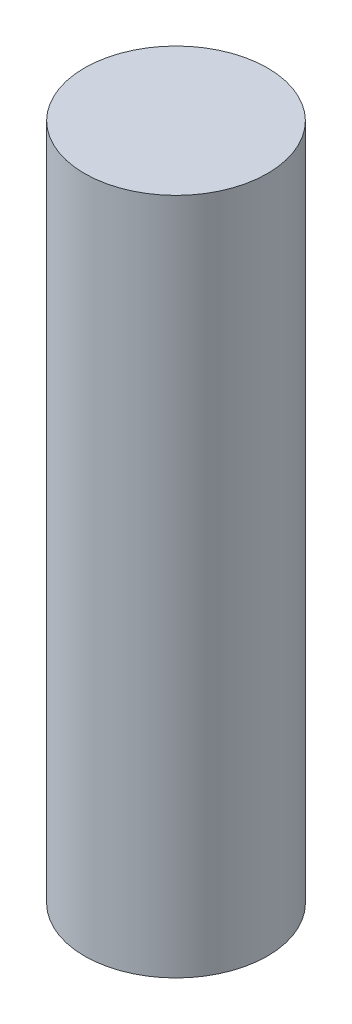
ISO-10303-21;
HEADER;
FILE_DESCRIPTION(('STEP AP214'),'2;1');
FILE_NAME('part.step','',(''),(''),'','','');
FILE_SCHEMA(('AUTOMOTIVE_DESIGN { 1 0 10303 214 1 1 1 1 }'));
ENDSEC;
DATA;
#1=APPLICATION_CONTEXT('core data for automotive mechanical design processes');
#2=APPLICATION_PROTOCOL_DEFINITION('international standard','automotive_design',2000,#1);
#3=PRODUCT_CONTEXT('',#1,'mechanical');
#4=PRODUCT('Part','Part','',(#3));
#5=PRODUCT_RELATED_PRODUCT_CATEGORY('part','',(#4));
#6=PRODUCT_DEFINITION_FORMATION('','',#4);
#7=PRODUCT_DEFINITION_CONTEXT('part definition',#1,'design');
#8=PRODUCT_DEFINITION('design','',#6,#7);
#9=PRODUCT_DEFINITION_SHAPE('','',#8);
#10=(LENGTH_UNIT() NAMED_UNIT(*) SI_UNIT(.MILLI.,.METRE.));
#11=(NAMED_UNIT(*) PLANE_ANGLE_UNIT() SI_UNIT($,.RADIAN.));
#12=(NAMED_UNIT(*) SI_UNIT($,.STERADIAN.) SOLID_ANGLE_UNIT());
#13=UNCERTAINTY_MEASURE_WITH_UNIT(LENGTH_MEASURE(1.E-05),#10,'distance_accuracy_value','');
#14=(GEOMETRIC_REPRESENTATION_CONTEXT(3) GLOBAL_UNCERTAINTY_ASSIGNED_CONTEXT((#13)) GLOBAL_UNIT_ASSIGNED_CONTEXT((#10,
#11,#12)) REPRESENTATION_CONTEXT('',''));
#15=CARTESIAN_POINT('',(0.,0.,0.));
#16=DIRECTION('',(0.,0.,1.));
#17=DIRECTION('',(1.,0.,0.));
#18=AXIS2_PLACEMENT_3D('',#15,#16,#17);
#19=CARTESIAN_POINT('',(0.,0.,0.));
#20=DIRECTION('',(0.,1.,0.));
#21=DIRECTION('',(0.,0.,1.));
#22=AXIS2_PLACEMENT_3D('',#19,#20,#21);
#23=PLANE('',#22);
#24=CARTESIAN_POINT('',(0.,0.,0.));
#25=DIRECTION('',(0.,1.,0.));
#26=DIRECTION('',(0.,0.,1.));
#27=AXIS2_PLACEMENT_3D('',#24,#25,#26);
#28=CIRCLE('',#27,6.75);
#29=CARTESIAN_POINT('',(0.,0.,6.75));
#30=VERTEX_POINT('',#29);
#31=EDGE_CURVE('E39',#30,#30,#28,.T.);
#32=ORIENTED_EDGE('',*,*,#31,.F.);
#33=EDGE_LOOP('',(#32));
#34=FACE_BOUND('',#33,.T.);
#35=ADVANCED_FACE('F32',(#34),#23,.F.);
#36=CARTESIAN_POINT('',(0.,50.,0.));
#37=DIRECTION('',(0.,1.,0.));
#38=DIRECTION('',(0.,0.,1.));
#39=AXIS2_PLACEMENT_3D('',#36,#37,#38);
#40=PLANE('',#39);
#41=CARTESIAN_POINT('',(0.,50.,0.));
#42=DIRECTION('',(0.,1.,0.));
#43=DIRECTION('',(0.,0.,1.));
#44=AXIS2_PLACEMENT_3D('',#41,#42,#43);
#45=CIRCLE('',#44,6.75);
#46=CARTESIAN_POINT('',(0.,50.,6.75));
#47=VERTEX_POINT('',#46);
#48=EDGE_CURVE('E11',#47,#47,#45,.T.);
#49=ORIENTED_EDGE('',*,*,#48,.T.);
#50=EDGE_LOOP('',(#49));
#51=FACE_BOUND('',#50,.T.);
#52=ADVANCED_FACE('F46',(#51),#40,.T.);
#53=CARTESIAN_POINT('',(0.,0.,0.));
#54=DIRECTION('',(0.,1.,0.));
#55=DIRECTION('',(0.,0.,1.));
#56=AXIS2_PLACEMENT_3D('',#53,#54,#55);
#57=CYLINDRICAL_SURFACE('',#56,6.75);
#58=ORIENTED_EDGE('',*,*,#48,.F.);
#59=EDGE_LOOP('',(#58));
#60=FACE_BOUND('',#59,.T.);
#61=ORIENTED_EDGE('',*,*,#31,.T.);
#62=EDGE_LOOP('',(#61));
#63=FACE_BOUND('',#62,.T.);
#64=ADVANCED_FACE('F48',(#60,#63),#57,.T.);
#65=CLOSED_SHELL('',(#35,#52,#64));
#66=MANIFOLD_SOLID_BREP('B2',#65);
#67=ADVANCED_BREP_SHAPE_REPRESENTATION('',(#18,#66),#14);
#68=SHAPE_DEFINITION_REPRESENTATION(#9,#67);
ENDSEC;
END-ISO-10303-21;
